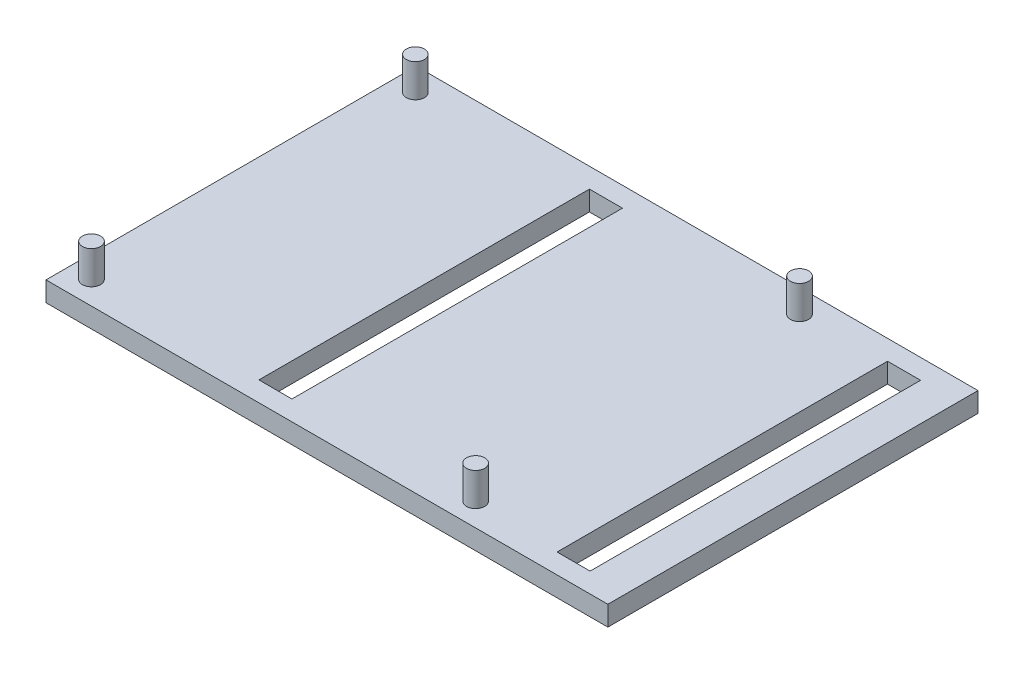
ISO-10303-21;
HEADER;
FILE_DESCRIPTION(('STEP AP214'),'2;1');
FILE_NAME('part.step','',(''),(''),'','','');
FILE_SCHEMA(('AUTOMOTIVE_DESIGN { 1 0 10303 214 1 1 1 1 }'));
ENDSEC;
DATA;
#1=APPLICATION_CONTEXT('core data for automotive mechanical design processes');
#2=APPLICATION_PROTOCOL_DEFINITION('international standard','automotive_design',2000,#1);
#3=PRODUCT_CONTEXT('',#1,'mechanical');
#4=PRODUCT('Part','Part','',(#3));
#5=PRODUCT_RELATED_PRODUCT_CATEGORY('part','',(#4));
#6=PRODUCT_DEFINITION_FORMATION('','',#4);
#7=PRODUCT_DEFINITION_CONTEXT('part definition',#1,'design');
#8=PRODUCT_DEFINITION('design','',#6,#7);
#9=PRODUCT_DEFINITION_SHAPE('','',#8);
#10=(LENGTH_UNIT() NAMED_UNIT(*) SI_UNIT(.MILLI.,.METRE.));
#11=(NAMED_UNIT(*) PLANE_ANGLE_UNIT() SI_UNIT($,.RADIAN.));
#12=(NAMED_UNIT(*) SI_UNIT($,.STERADIAN.) SOLID_ANGLE_UNIT());
#13=UNCERTAINTY_MEASURE_WITH_UNIT(LENGTH_MEASURE(1.E-05),#10,'distance_accuracy_value','');
#14=(GEOMETRIC_REPRESENTATION_CONTEXT(3) GLOBAL_UNCERTAINTY_ASSIGNED_CONTEXT((#13)) GLOBAL_UNIT_ASSIGNED_CONTEXT((#10,
#11,#12)) REPRESENTATION_CONTEXT('',''));
#15=CARTESIAN_POINT('',(0.,0.,0.));
#16=DIRECTION('',(0.,0.,1.));
#17=DIRECTION('',(1.,0.,0.));
#18=AXIS2_PLACEMENT_3D('',#15,#16,#17);
#19=CARTESIAN_POINT('',(0.,0.,0.));
#20=DIRECTION('',(0.,-1.,0.));
#21=DIRECTION('',(0.,0.,-1.));
#22=AXIS2_PLACEMENT_3D('',#19,#20,#21);
#23=PLANE('',#22);
#24=CARTESIAN_POINT('',(19.,0.,24.5));
#25=DIRECTION('',(0.,-1.,0.));
#26=DIRECTION('',(0.,0.,-1.));
#27=AXIS2_PLACEMENT_3D('',#24,#25,#26);
#28=CIRCLE('',#27,2.76);
#29=CARTESIAN_POINT('',(19.,0.,21.74));
#30=VERTEX_POINT('',#29);
#31=EDGE_CURVE('E253',#30,#30,#28,.T.);
#32=ORIENTED_EDGE('',*,*,#31,.F.);
#33=EDGE_LOOP('',(#32));
#34=FACE_BOUND('',#33,.T.);
#35=CARTESIAN_POINT('',(19.,0.,-24.5));
#36=DIRECTION('',(0.,1.,0.));
#37=DIRECTION('',(0.,0.,1.));
#38=AXIS2_PLACEMENT_3D('',#35,#36,#37);
#39=CIRCLE('',#38,2.76);
#40=CARTESIAN_POINT('',(19.,0.,-21.74));
#41=VERTEX_POINT('',#40);
#42=EDGE_CURVE('E209',#41,#41,#39,.T.);
#43=ORIENTED_EDGE('',*,*,#42,.T.);
#44=EDGE_LOOP('',(#43));
#45=FACE_BOUND('',#44,.T.);
#46=DIRECTION('',(-1.,0.,0.));
#47=VECTOR('',#46,1.);
#48=CARTESIAN_POINT('',(-8.28756070361921,0.,-25.));
#49=LINE('',#48,#47);
#50=CARTESIAN_POINT('',(-8.28756070361921,0.,-25.));
#51=VERTEX_POINT('',#50);
#52=CARTESIAN_POINT('',(-13.2875607036192,0.,-25.));
#53=VERTEX_POINT('',#52);
#54=EDGE_CURVE('E191',#51,#53,#49,.T.);
#55=ORIENTED_EDGE('',*,*,#54,.T.);
#56=DIRECTION('',(0.,0.,1.));
#57=VECTOR('',#56,1.);
#58=CARTESIAN_POINT('',(-13.2875607036192,0.,-25.));
#59=LINE('',#58,#57);
#60=CARTESIAN_POINT('',(-13.2875607036192,0.,25.));
#61=VERTEX_POINT('',#60);
#62=EDGE_CURVE('E187',#53,#61,#59,.T.);
#63=ORIENTED_EDGE('',*,*,#62,.T.);
#64=DIRECTION('',(1.,0.,0.));
#65=VECTOR('',#64,1.);
#66=CARTESIAN_POINT('',(-8.28756070361921,0.,25.));
#67=LINE('',#66,#65);
#68=CARTESIAN_POINT('',(-8.28756070361921,0.,25.));
#69=VERTEX_POINT('',#68);
#70=EDGE_CURVE('E190',#61,#69,#67,.T.);
#71=ORIENTED_EDGE('',*,*,#70,.T.);
#72=DIRECTION('',(0.,0.,-1.));
#73=VECTOR('',#72,1.);
#74=CARTESIAN_POINT('',(-8.28756070361921,0.,-25.));
#75=LINE('',#74,#73);
#76=EDGE_CURVE('E170',#69,#51,#75,.T.);
#77=ORIENTED_EDGE('',*,*,#76,.T.);
#78=EDGE_LOOP('',(#55,#63,#71,#77));
#79=FACE_BOUND('',#78,.T.);
#80=DIRECTION('',(0.,0.,1.));
#81=VECTOR('',#80,1.);
#82=CARTESIAN_POINT('',(-42.5,0.,-28.));
#83=LINE('',#82,#81);
#84=CARTESIAN_POINT('',(-42.5,0.,-28.));
#85=VERTEX_POINT('',#84);
#86=CARTESIAN_POINT('',(-42.5,0.,28.));
#87=VERTEX_POINT('',#86);
#88=EDGE_CURVE('E167',#85,#87,#83,.T.);
#89=ORIENTED_EDGE('',*,*,#88,.F.);
#90=DIRECTION('',(-1.,0.,0.));
#91=VECTOR('',#90,1.);
#92=CARTESIAN_POINT('',(42.5,0.,-28.));
#93=LINE('',#92,#91);
#94=CARTESIAN_POINT('',(42.5,0.,-28.));
#95=VERTEX_POINT('',#94);
#96=EDGE_CURVE('E223',#95,#85,#93,.T.);
#97=ORIENTED_EDGE('',*,*,#96,.F.);
#98=DIRECTION('',(0.,0.,-1.));
#99=VECTOR('',#98,1.);
#100=CARTESIAN_POINT('',(42.5,0.,-28.));
#101=LINE('',#100,#99);
#102=CARTESIAN_POINT('',(42.5,0.,28.));
#103=VERTEX_POINT('',#102);
#104=EDGE_CURVE('E220',#103,#95,#101,.T.);
#105=ORIENTED_EDGE('',*,*,#104,.F.);
#106=DIRECTION('',(1.,0.,0.));
#107=VECTOR('',#106,1.);
#108=CARTESIAN_POINT('',(42.5,0.,28.));
#109=LINE('',#108,#107);
#110=EDGE_CURVE('E217',#87,#103,#109,.T.);
#111=ORIENTED_EDGE('',*,*,#110,.F.);
#112=EDGE_LOOP('',(#89,#97,#105,#111));
#113=FACE_BOUND('',#112,.T.);
#114=DIRECTION('',(-1.,0.,0.));
#115=VECTOR('',#114,1.);
#116=CARTESIAN_POINT('',(31.8133356797978,0.,-25.));
#117=LINE('',#116,#115);
#118=CARTESIAN_POINT('',(36.8133356797978,0.,-25.));
#119=VERTEX_POINT('',#118);
#120=CARTESIAN_POINT('',(31.8133356797978,0.,-25.));
#121=VERTEX_POINT('',#120);
#122=EDGE_CURVE('E162',#119,#121,#117,.T.);
#123=ORIENTED_EDGE('',*,*,#122,.T.);
#124=DIRECTION('',(0.,0.,1.));
#125=VECTOR('',#124,1.);
#126=CARTESIAN_POINT('',(31.8133356797978,0.,-25.));
#127=LINE('',#126,#125);
#128=CARTESIAN_POINT('',(31.8133356797978,0.,25.));
#129=VERTEX_POINT('',#128);
#130=EDGE_CURVE('E128',#121,#129,#127,.T.);
#131=ORIENTED_EDGE('',*,*,#130,.T.);
#132=DIRECTION('',(1.,0.,0.));
#133=VECTOR('',#132,1.);
#134=CARTESIAN_POINT('',(31.8133356797978,0.,25.));
#135=LINE('',#134,#133);
#136=CARTESIAN_POINT('',(36.8133356797978,0.,25.));
#137=VERTEX_POINT('',#136);
#138=EDGE_CURVE('E146',#129,#137,#135,.T.);
#139=ORIENTED_EDGE('',*,*,#138,.T.);
#140=DIRECTION('',(0.,0.,-1.));
#141=VECTOR('',#140,1.);
#142=CARTESIAN_POINT('',(36.8133356797978,0.,-25.));
#143=LINE('',#142,#141);
#144=EDGE_CURVE('E164',#137,#119,#143,.T.);
#145=ORIENTED_EDGE('',*,*,#144,.T.);
#146=EDGE_LOOP('',(#123,#131,#139,#145));
#147=FACE_BOUND('',#146,.T.);
#148=CARTESIAN_POINT('',(-39.1182865134503,0.,-24.5));
#149=DIRECTION('',(0.,1.,0.));
#150=DIRECTION('',(0.,0.,1.));
#151=AXIS2_PLACEMENT_3D('',#148,#149,#150);
#152=CIRCLE('',#151,2.76);
#153=CARTESIAN_POINT('',(-39.1182865134503,0.,-21.74));
#154=VERTEX_POINT('',#153);
#155=EDGE_CURVE('E250',#154,#154,#152,.T.);
#156=ORIENTED_EDGE('',*,*,#155,.T.);
#157=EDGE_LOOP('',(#156));
#158=FACE_BOUND('',#157,.T.);
#159=CARTESIAN_POINT('',(-39.1182865134503,0.,24.5));
#160=DIRECTION('',(0.,-1.,0.));
#161=DIRECTION('',(0.,0.,-1.));
#162=AXIS2_PLACEMENT_3D('',#159,#160,#161);
#163=CIRCLE('',#162,2.76);
#164=CARTESIAN_POINT('',(-39.1182865134503,0.,21.74));
#165=VERTEX_POINT('',#164);
#166=EDGE_CURVE('E262',#165,#165,#163,.T.);
#167=ORIENTED_EDGE('',*,*,#166,.F.);
#168=EDGE_LOOP('',(#167));
#169=FACE_BOUND('',#168,.T.);
#170=ADVANCED_FACE('F44',(#34,#45,#79,#113,#147,#158,#169),#23,.T.);
#171=CARTESIAN_POINT('',(-39.1182865134503,6.88908729652602,24.5));
#172=DIRECTION('',(0.,-1.,0.));
#173=DIRECTION('',(0.,0.,-1.));
#174=AXIS2_PLACEMENT_3D('',#171,#172,#173);
#175=CYLINDRICAL_SURFACE('',#174,1.375);
#176=CARTESIAN_POINT('',(-39.1182865134503,3.,24.5));
#177=DIRECTION('',(0.,-1.,0.));
#178=DIRECTION('',(0.,0.,-1.));
#179=AXIS2_PLACEMENT_3D('',#176,#177,#178);
#180=CIRCLE('',#179,1.375);
#181=CARTESIAN_POINT('',(-39.1182865134503,3.,23.125));
#182=VERTEX_POINT('',#181);
#183=EDGE_CURVE('E12',#182,#182,#180,.F.);
#184=ORIENTED_EDGE('',*,*,#183,.T.);
#185=EDGE_LOOP('',(#184));
#186=FACE_BOUND('',#185,.T.);
#187=CARTESIAN_POINT('',(-39.1182865134503,2.,24.5));
#188=DIRECTION('',(0.,-1.,0.));
#189=DIRECTION('',(0.,0.,-1.));
#190=AXIS2_PLACEMENT_3D('',#187,#188,#189);
#191=CIRCLE('',#190,1.375);
#192=CARTESIAN_POINT('',(-39.1182865134503,2.,23.125));
#193=VERTEX_POINT('',#192);
#194=EDGE_CURVE('E259',#193,#193,#191,.T.);
#195=ORIENTED_EDGE('',*,*,#194,.T.);
#196=EDGE_LOOP('',(#195));
#197=FACE_BOUND('',#196,.T.);
#198=ADVANCED_FACE('F46',(#186,#197),#175,.F.);
#199=CARTESIAN_POINT('',(19.,6.88908729652602,24.5));
#200=DIRECTION('',(0.,-1.,0.));
#201=DIRECTION('',(0.,0.,-1.));
#202=AXIS2_PLACEMENT_3D('',#199,#200,#201);
#203=CYLINDRICAL_SURFACE('',#202,1.37499999999999);
#204=CARTESIAN_POINT('',(19.,3.,24.5));
#205=DIRECTION('',(0.,-1.,0.));
#206=DIRECTION('',(0.,0.,-1.));
#207=AXIS2_PLACEMENT_3D('',#204,#205,#206);
#208=CIRCLE('',#207,1.37499999999999);
#209=CARTESIAN_POINT('',(19.,3.,23.125));
#210=VERTEX_POINT('',#209);
#211=EDGE_CURVE('E172',#210,#210,#208,.F.);
#212=ORIENTED_EDGE('',*,*,#211,.T.);
#213=EDGE_LOOP('',(#212));
#214=FACE_BOUND('',#213,.T.);
#215=CARTESIAN_POINT('',(19.,2.,24.5));
#216=DIRECTION('',(0.,-1.,0.));
#217=DIRECTION('',(0.,0.,-1.));
#218=AXIS2_PLACEMENT_3D('',#215,#216,#217);
#219=CIRCLE('',#218,1.375);
#220=CARTESIAN_POINT('',(19.,2.,23.125));
#221=VERTEX_POINT('',#220);
#222=EDGE_CURVE('E256',#221,#221,#219,.T.);
#223=ORIENTED_EDGE('',*,*,#222,.T.);
#224=EDGE_LOOP('',(#223));
#225=FACE_BOUND('',#224,.T.);
#226=ADVANCED_FACE('F276',(#214,#225),#203,.F.);
#227=CARTESIAN_POINT('',(-39.1182865134503,6.88908729652602,-24.5));
#228=DIRECTION('',(0.,-1.,0.));
#229=DIRECTION('',(0.,0.,-1.));
#230=AXIS2_PLACEMENT_3D('',#227,#228,#229);
#231=CYLINDRICAL_SURFACE('',#230,1.375);
#232=CARTESIAN_POINT('',(-39.1182865134503,3.,-24.5));
#233=DIRECTION('',(0.,-1.,0.));
#234=DIRECTION('',(0.,0.,-1.));
#235=AXIS2_PLACEMENT_3D('',#232,#233,#234);
#236=CIRCLE('',#235,1.375);
#237=CARTESIAN_POINT('',(-39.1182865134503,3.,-25.875));
#238=VERTEX_POINT('',#237);
#239=EDGE_CURVE('E53',#238,#238,#236,.F.);
#240=ORIENTED_EDGE('',*,*,#239,.T.);
#241=EDGE_LOOP('',(#240));
#242=FACE_BOUND('',#241,.T.);
#243=CARTESIAN_POINT('',(-39.1182865134503,2.,-24.5));
#244=DIRECTION('',(0.,1.,0.));
#245=DIRECTION('',(0.,0.,1.));
#246=AXIS2_PLACEMENT_3D('',#243,#244,#245);
#247=CIRCLE('',#246,1.375);
#248=CARTESIAN_POINT('',(-39.1182865134503,2.,-23.125));
#249=VERTEX_POINT('',#248);
#250=EDGE_CURVE('E247',#249,#249,#247,.T.);
#251=ORIENTED_EDGE('',*,*,#250,.F.);
#252=EDGE_LOOP('',(#251));
#253=FACE_BOUND('',#252,.T.);
#254=ADVANCED_FACE('F301',(#242,#253),#231,.F.);
#255=CARTESIAN_POINT('',(19.,6.88908729652602,-24.5));
#256=DIRECTION('',(0.,-1.,0.));
#257=DIRECTION('',(0.,0.,-1.));
#258=AXIS2_PLACEMENT_3D('',#255,#256,#257);
#259=CYLINDRICAL_SURFACE('',#258,1.375);
#260=CARTESIAN_POINT('',(19.,3.,-24.5));
#261=DIRECTION('',(0.,-1.,0.));
#262=DIRECTION('',(0.,0.,-1.));
#263=AXIS2_PLACEMENT_3D('',#260,#261,#262);
#264=CIRCLE('',#263,1.375);
#265=CARTESIAN_POINT('',(19.,3.,-25.875));
#266=VERTEX_POINT('',#265);
#267=EDGE_CURVE('E232',#266,#266,#264,.F.);
#268=ORIENTED_EDGE('',*,*,#267,.T.);
#269=EDGE_LOOP('',(#268));
#270=FACE_BOUND('',#269,.T.);
#271=CARTESIAN_POINT('',(19.,2.,-24.5));
#272=DIRECTION('',(0.,1.,0.));
#273=DIRECTION('',(0.,0.,1.));
#274=AXIS2_PLACEMENT_3D('',#271,#272,#273);
#275=CIRCLE('',#274,1.375);
#276=CARTESIAN_POINT('',(19.,2.,-23.125));
#277=VERTEX_POINT('',#276);
#278=EDGE_CURVE('E244',#277,#277,#275,.T.);
#279=ORIENTED_EDGE('',*,*,#278,.F.);
#280=EDGE_LOOP('',(#279));
#281=FACE_BOUND('',#280,.T.);
#282=ADVANCED_FACE('F299',(#270,#281),#259,.F.);
#283=CARTESIAN_POINT('',(0.,3.,0.));
#284=DIRECTION('',(0.,-1.,0.));
#285=DIRECTION('',(0.,0.,-1.));
#286=AXIS2_PLACEMENT_3D('',#283,#284,#285);
#287=PLANE('',#286);
#288=ORIENTED_EDGE('',*,*,#267,.F.);
#289=EDGE_LOOP('',(#288));
#290=FACE_BOUND('',#289,.T.);
#291=ORIENTED_EDGE('',*,*,#239,.F.);
#292=EDGE_LOOP('',(#291));
#293=FACE_BOUND('',#292,.T.);
#294=DIRECTION('',(0.,0.,1.));
#295=VECTOR('',#294,1.);
#296=CARTESIAN_POINT('',(-13.2875607036192,3.,-25.));
#297=LINE('',#296,#295);
#298=CARTESIAN_POINT('',(-13.2875607036192,3.,-25.));
#299=VERTEX_POINT('',#298);
#300=CARTESIAN_POINT('',(-13.2875607036192,3.,25.));
#301=VERTEX_POINT('',#300);
#302=EDGE_CURVE('E174',#299,#301,#297,.T.);
#303=ORIENTED_EDGE('',*,*,#302,.F.);
#304=DIRECTION('',(-1.,0.,0.));
#305=VECTOR('',#304,1.);
#306=CARTESIAN_POINT('',(-8.28756070361921,3.,-25.));
#307=LINE('',#306,#305);
#308=CARTESIAN_POINT('',(-8.28756070361921,3.,-25.));
#309=VERTEX_POINT('',#308);
#310=EDGE_CURVE('E185',#309,#299,#307,.T.);
#311=ORIENTED_EDGE('',*,*,#310,.F.);
#312=DIRECTION('',(0.,0.,-1.));
#313=VECTOR('',#312,1.);
#314=CARTESIAN_POINT('',(-8.28756070361921,3.,-25.));
#315=LINE('',#314,#313);
#316=CARTESIAN_POINT('',(-8.28756070361921,3.,25.));
#317=VERTEX_POINT('',#316);
#318=EDGE_CURVE('E181',#317,#309,#315,.T.);
#319=ORIENTED_EDGE('',*,*,#318,.F.);
#320=DIRECTION('',(1.,0.,0.));
#321=VECTOR('',#320,1.);
#322=CARTESIAN_POINT('',(-8.28756070361921,3.,25.));
#323=LINE('',#322,#321);
#324=EDGE_CURVE('E178',#301,#317,#323,.T.);
#325=ORIENTED_EDGE('',*,*,#324,.F.);
#326=EDGE_LOOP('',(#303,#311,#319,#325));
#327=FACE_BOUND('',#326,.T.);
#328=DIRECTION('',(0.,0.,1.));
#329=VECTOR('',#328,1.);
#330=CARTESIAN_POINT('',(-42.5,3.,-28.));
#331=LINE('',#330,#329);
#332=CARTESIAN_POINT('',(-42.5,3.,-28.));
#333=VERTEX_POINT('',#332);
#334=CARTESIAN_POINT('',(-42.5,3.,28.));
#335=VERTEX_POINT('',#334);
#336=EDGE_CURVE('E205',#333,#335,#331,.T.);
#337=ORIENTED_EDGE('',*,*,#336,.T.);
#338=DIRECTION('',(1.,0.,0.));
#339=VECTOR('',#338,1.);
#340=CARTESIAN_POINT('',(42.5,3.,28.));
#341=LINE('',#340,#339);
#342=CARTESIAN_POINT('',(42.5,3.,28.));
#343=VERTEX_POINT('',#342);
#344=EDGE_CURVE('E208',#335,#343,#341,.T.);
#345=ORIENTED_EDGE('',*,*,#344,.T.);
#346=DIRECTION('',(0.,0.,-1.));
#347=VECTOR('',#346,1.);
#348=CARTESIAN_POINT('',(42.5,3.,-28.));
#349=LINE('',#348,#347);
#350=CARTESIAN_POINT('',(42.5,3.,-28.));
#351=VERTEX_POINT('',#350);
#352=EDGE_CURVE('E211',#343,#351,#349,.T.);
#353=ORIENTED_EDGE('',*,*,#352,.T.);
#354=DIRECTION('',(-1.,0.,0.));
#355=VECTOR('',#354,1.);
#356=CARTESIAN_POINT('',(42.5,3.,-28.));
#357=LINE('',#356,#355);
#358=EDGE_CURVE('E198',#351,#333,#357,.T.);
#359=ORIENTED_EDGE('',*,*,#358,.T.);
#360=EDGE_LOOP('',(#337,#345,#353,#359));
#361=FACE_BOUND('',#360,.T.);
#362=DIRECTION('',(0.,0.,1.));
#363=VECTOR('',#362,1.);
#364=CARTESIAN_POINT('',(31.8133356797978,3.,-25.));
#365=LINE('',#364,#363);
#366=CARTESIAN_POINT('',(31.8133356797978,3.,-25.));
#367=VERTEX_POINT('',#366);
#368=CARTESIAN_POINT('',(31.8133356797978,3.,25.));
#369=VERTEX_POINT('',#368);
#370=EDGE_CURVE('E131',#367,#369,#365,.T.);
#371=ORIENTED_EDGE('',*,*,#370,.F.);
#372=DIRECTION('',(-1.,0.,0.));
#373=VECTOR('',#372,1.);
#374=CARTESIAN_POINT('',(31.8133356797978,3.,-25.));
#375=LINE('',#374,#373);
#376=CARTESIAN_POINT('',(36.8133356797978,3.,-25.));
#377=VERTEX_POINT('',#376);
#378=EDGE_CURVE('E60',#377,#367,#375,.T.);
#379=ORIENTED_EDGE('',*,*,#378,.F.);
#380=DIRECTION('',(0.,0.,-1.));
#381=VECTOR('',#380,1.);
#382=CARTESIAN_POINT('',(36.8133356797978,3.,-25.));
#383=LINE('',#382,#381);
#384=CARTESIAN_POINT('',(36.8133356797978,3.,25.));
#385=VERTEX_POINT('',#384);
#386=EDGE_CURVE('E152',#385,#377,#383,.T.);
#387=ORIENTED_EDGE('',*,*,#386,.F.);
#388=DIRECTION('',(1.,0.,0.));
#389=VECTOR('',#388,1.);
#390=CARTESIAN_POINT('',(31.8133356797978,3.,25.));
#391=LINE('',#390,#389);
#392=EDGE_CURVE('E143',#369,#385,#391,.T.);
#393=ORIENTED_EDGE('',*,*,#392,.F.);
#394=EDGE_LOOP('',(#371,#379,#387,#393));
#395=FACE_BOUND('',#394,.T.);
#396=ORIENTED_EDGE('',*,*,#183,.F.);
#397=EDGE_LOOP('',(#396));
#398=FACE_BOUND('',#397,.T.);
#399=ORIENTED_EDGE('',*,*,#211,.F.);
#400=EDGE_LOOP('',(#399));
#401=FACE_BOUND('',#400,.T.);
#402=ADVANCED_FACE('F149',(#290,#293,#327,#361,#395,#398,#401),#287,.F.);
#403=CARTESIAN_POINT('',(-42.5,3.,-28.));
#404=DIRECTION('',(1.,0.,0.));
#405=DIRECTION('',(0.,0.,-1.));
#406=AXIS2_PLACEMENT_3D('',#403,#404,#405);
#407=PLANE('',#406);
#408=ORIENTED_EDGE('',*,*,#88,.T.);
#409=DIRECTION('',(0.,-1.,0.));
#410=VECTOR('',#409,1.);
#411=CARTESIAN_POINT('',(-42.5,3.,28.));
#412=LINE('',#411,#410);
#413=EDGE_CURVE('E219',#335,#87,#412,.T.);
#414=ORIENTED_EDGE('',*,*,#413,.F.);
#415=ORIENTED_EDGE('',*,*,#336,.F.);
#416=DIRECTION('',(0.,-1.,0.));
#417=VECTOR('',#416,1.);
#418=CARTESIAN_POINT('',(-42.5,3.,-28.));
#419=LINE('',#418,#417);
#420=EDGE_CURVE('E216',#333,#85,#419,.T.);
#421=ORIENTED_EDGE('',*,*,#420,.T.);
#422=EDGE_LOOP('',(#408,#414,#415,#421));
#423=FACE_BOUND('',#422,.T.);
#424=ADVANCED_FACE('F295',(#423),#407,.F.);
#425=CARTESIAN_POINT('',(42.5,3.,28.));
#426=DIRECTION('',(0.,0.,-1.));
#427=DIRECTION('',(-1.,0.,0.));
#428=AXIS2_PLACEMENT_3D('',#425,#426,#427);
#429=PLANE('',#428);
#430=ORIENTED_EDGE('',*,*,#110,.T.);
#431=DIRECTION('',(0.,-1.,0.));
#432=VECTOR('',#431,1.);
#433=CARTESIAN_POINT('',(42.5,3.,28.));
#434=LINE('',#433,#432);
#435=EDGE_CURVE('E222',#343,#103,#434,.T.);
#436=ORIENTED_EDGE('',*,*,#435,.F.);
#437=ORIENTED_EDGE('',*,*,#344,.F.);
#438=ORIENTED_EDGE('',*,*,#413,.T.);
#439=EDGE_LOOP('',(#430,#436,#437,#438));
#440=FACE_BOUND('',#439,.T.);
#441=ADVANCED_FACE('F291',(#440),#429,.F.);
#442=CARTESIAN_POINT('',(42.5,3.,-28.));
#443=DIRECTION('',(-1.,0.,0.));
#444=DIRECTION('',(0.,0.,1.));
#445=AXIS2_PLACEMENT_3D('',#442,#443,#444);
#446=PLANE('',#445);
#447=ORIENTED_EDGE('',*,*,#104,.T.);
#448=DIRECTION('',(0.,-1.,0.));
#449=VECTOR('',#448,1.);
#450=CARTESIAN_POINT('',(42.5,3.,-28.));
#451=LINE('',#450,#449);
#452=EDGE_CURVE('E177',#351,#95,#451,.T.);
#453=ORIENTED_EDGE('',*,*,#452,.F.);
#454=ORIENTED_EDGE('',*,*,#352,.F.);
#455=ORIENTED_EDGE('',*,*,#435,.T.);
#456=EDGE_LOOP('',(#447,#453,#454,#455));
#457=FACE_BOUND('',#456,.T.);
#458=ADVANCED_FACE('F287',(#457),#446,.F.);
#459=CARTESIAN_POINT('',(42.5,3.,-28.));
#460=DIRECTION('',(0.,0.,1.));
#461=DIRECTION('',(1.,0.,0.));
#462=AXIS2_PLACEMENT_3D('',#459,#460,#461);
#463=PLANE('',#462);
#464=ORIENTED_EDGE('',*,*,#96,.T.);
#465=ORIENTED_EDGE('',*,*,#420,.F.);
#466=ORIENTED_EDGE('',*,*,#358,.F.);
#467=ORIENTED_EDGE('',*,*,#452,.T.);
#468=EDGE_LOOP('',(#464,#465,#466,#467));
#469=FACE_BOUND('',#468,.T.);
#470=ADVANCED_FACE('F283',(#469),#463,.F.);
#471=CARTESIAN_POINT('',(-13.2875607036192,3.,-25.));
#472=DIRECTION('',(1.,0.,0.));
#473=DIRECTION('',(0.,0.,-1.));
#474=AXIS2_PLACEMENT_3D('',#471,#472,#473);
#475=PLANE('',#474);
#476=ORIENTED_EDGE('',*,*,#62,.F.);
#477=DIRECTION('',(0.,-1.,0.));
#478=VECTOR('',#477,1.);
#479=CARTESIAN_POINT('',(-13.2875607036192,3.,-25.));
#480=LINE('',#479,#478);
#481=EDGE_CURVE('E138',#299,#53,#480,.T.);
#482=ORIENTED_EDGE('',*,*,#481,.F.);
#483=ORIENTED_EDGE('',*,*,#302,.T.);
#484=DIRECTION('',(0.,-1.,0.));
#485=VECTOR('',#484,1.);
#486=CARTESIAN_POINT('',(-13.2875607036192,3.,25.));
#487=LINE('',#486,#485);
#488=EDGE_CURVE('E176',#301,#61,#487,.T.);
#489=ORIENTED_EDGE('',*,*,#488,.T.);
#490=EDGE_LOOP('',(#476,#482,#483,#489));
#491=FACE_BOUND('',#490,.T.);
#492=ADVANCED_FACE('F286',(#491),#475,.T.);
#493=CARTESIAN_POINT('',(-8.28756070361921,3.,25.));
#494=DIRECTION('',(0.,0.,-1.));
#495=DIRECTION('',(-1.,0.,0.));
#496=AXIS2_PLACEMENT_3D('',#493,#494,#495);
#497=PLANE('',#496);
#498=ORIENTED_EDGE('',*,*,#70,.F.);
#499=ORIENTED_EDGE('',*,*,#488,.F.);
#500=ORIENTED_EDGE('',*,*,#324,.T.);
#501=DIRECTION('',(0.,-1.,0.));
#502=VECTOR('',#501,1.);
#503=CARTESIAN_POINT('',(-8.28756070361921,3.,25.));
#504=LINE('',#503,#502);
#505=EDGE_CURVE('E180',#317,#69,#504,.T.);
#506=ORIENTED_EDGE('',*,*,#505,.T.);
#507=EDGE_LOOP('',(#498,#499,#500,#506));
#508=FACE_BOUND('',#507,.T.);
#509=ADVANCED_FACE('F358',(#508),#497,.T.);
#510=CARTESIAN_POINT('',(-8.28756070361921,3.,-25.));
#511=DIRECTION('',(-1.,0.,0.));
#512=DIRECTION('',(0.,0.,1.));
#513=AXIS2_PLACEMENT_3D('',#510,#511,#512);
#514=PLANE('',#513);
#515=ORIENTED_EDGE('',*,*,#76,.F.);
#516=ORIENTED_EDGE('',*,*,#505,.F.);
#517=ORIENTED_EDGE('',*,*,#318,.T.);
#518=DIRECTION('',(0.,-1.,0.));
#519=VECTOR('',#518,1.);
#520=CARTESIAN_POINT('',(-8.28756070361921,3.,-25.));
#521=LINE('',#520,#519);
#522=EDGE_CURVE('E184',#309,#51,#521,.T.);
#523=ORIENTED_EDGE('',*,*,#522,.T.);
#524=EDGE_LOOP('',(#515,#516,#517,#523));
#525=FACE_BOUND('',#524,.T.);
#526=ADVANCED_FACE('F354',(#525),#514,.T.);
#527=CARTESIAN_POINT('',(-8.28756070361921,3.,-25.));
#528=DIRECTION('',(0.,0.,1.));
#529=DIRECTION('',(1.,0.,0.));
#530=AXIS2_PLACEMENT_3D('',#527,#528,#529);
#531=PLANE('',#530);
#532=ORIENTED_EDGE('',*,*,#54,.F.);
#533=ORIENTED_EDGE('',*,*,#522,.F.);
#534=ORIENTED_EDGE('',*,*,#310,.T.);
#535=ORIENTED_EDGE('',*,*,#481,.T.);
#536=EDGE_LOOP('',(#532,#533,#534,#535));
#537=FACE_BOUND('',#536,.T.);
#538=ADVANCED_FACE('F351',(#537),#531,.T.);
#539=CARTESIAN_POINT('',(31.8133356797978,3.,-25.));
#540=DIRECTION('',(1.,0.,0.));
#541=DIRECTION('',(0.,0.,-1.));
#542=AXIS2_PLACEMENT_3D('',#539,#540,#541);
#543=PLANE('',#542);
#544=ORIENTED_EDGE('',*,*,#130,.F.);
#545=DIRECTION('',(0.,-1.,0.));
#546=VECTOR('',#545,1.);
#547=CARTESIAN_POINT('',(31.8133356797978,3.,-25.));
#548=LINE('',#547,#546);
#549=EDGE_CURVE('E135',#367,#121,#548,.T.);
#550=ORIENTED_EDGE('',*,*,#549,.F.);
#551=ORIENTED_EDGE('',*,*,#370,.T.);
#552=DIRECTION('',(0.,-1.,0.));
#553=VECTOR('',#552,1.);
#554=CARTESIAN_POINT('',(31.8133356797978,3.,25.));
#555=LINE('',#554,#553);
#556=EDGE_CURVE('E134',#369,#129,#555,.T.);
#557=ORIENTED_EDGE('',*,*,#556,.T.);
#558=EDGE_LOOP('',(#544,#550,#551,#557));
#559=FACE_BOUND('',#558,.T.);
#560=ADVANCED_FACE('F133',(#559),#543,.T.);
#561=CARTESIAN_POINT('',(31.8133356797978,3.,25.));
#562=DIRECTION('',(0.,0.,-1.));
#563=DIRECTION('',(-1.,0.,0.));
#564=AXIS2_PLACEMENT_3D('',#561,#562,#563);
#565=PLANE('',#564);
#566=ORIENTED_EDGE('',*,*,#138,.F.);
#567=ORIENTED_EDGE('',*,*,#556,.F.);
#568=ORIENTED_EDGE('',*,*,#392,.T.);
#569=DIRECTION('',(0.,-1.,0.));
#570=VECTOR('',#569,1.);
#571=CARTESIAN_POINT('',(36.8133356797978,3.,25.));
#572=LINE('',#571,#570);
#573=EDGE_CURVE('E153',#385,#137,#572,.T.);
#574=ORIENTED_EDGE('',*,*,#573,.T.);
#575=EDGE_LOOP('',(#566,#567,#568,#574));
#576=FACE_BOUND('',#575,.T.);
#577=ADVANCED_FACE('F142',(#576),#565,.T.);
#578=CARTESIAN_POINT('',(36.8133356797978,3.,-25.));
#579=DIRECTION('',(-1.,0.,0.));
#580=DIRECTION('',(0.,0.,1.));
#581=AXIS2_PLACEMENT_3D('',#578,#579,#580);
#582=PLANE('',#581);
#583=ORIENTED_EDGE('',*,*,#144,.F.);
#584=ORIENTED_EDGE('',*,*,#573,.F.);
#585=ORIENTED_EDGE('',*,*,#386,.T.);
#586=DIRECTION('',(0.,-1.,0.));
#587=VECTOR('',#586,1.);
#588=CARTESIAN_POINT('',(36.8133356797978,3.,-25.));
#589=LINE('',#588,#587);
#590=EDGE_CURVE('E159',#377,#119,#589,.T.);
#591=ORIENTED_EDGE('',*,*,#590,.T.);
#592=EDGE_LOOP('',(#583,#584,#585,#591));
#593=FACE_BOUND('',#592,.T.);
#594=ADVANCED_FACE('F343',(#593),#582,.T.);
#595=CARTESIAN_POINT('',(31.8133356797978,3.,-25.));
#596=DIRECTION('',(0.,0.,1.));
#597=DIRECTION('',(1.,0.,0.));
#598=AXIS2_PLACEMENT_3D('',#595,#596,#597);
#599=PLANE('',#598);
#600=ORIENTED_EDGE('',*,*,#122,.F.);
#601=ORIENTED_EDGE('',*,*,#590,.F.);
#602=ORIENTED_EDGE('',*,*,#378,.T.);
#603=ORIENTED_EDGE('',*,*,#549,.T.);
#604=EDGE_LOOP('',(#600,#601,#602,#603));
#605=FACE_BOUND('',#604,.T.);
#606=ADVANCED_FACE('F316',(#605),#599,.T.);
#607=CARTESIAN_POINT('',(19.,0.,-24.5));
#608=DIRECTION('',(0.,-1.,0.));
#609=DIRECTION('',(0.,0.,-1.));
#610=AXIS2_PLACEMENT_3D('',#607,#608,#609);
#611=CONICAL_SURFACE('',#610,2.76,0.60567465190529);
#612=ORIENTED_EDGE('',*,*,#278,.T.);
#613=EDGE_LOOP('',(#612));
#614=FACE_BOUND('',#613,.T.);
#615=ORIENTED_EDGE('',*,*,#42,.F.);
#616=EDGE_LOOP('',(#615));
#617=FACE_BOUND('',#616,.T.);
#618=ADVANCED_FACE('F313',(#614,#617),#611,.F.);
#619=CARTESIAN_POINT('',(-39.1182865134503,0.,-24.5));
#620=DIRECTION('',(0.,-1.,0.));
#621=DIRECTION('',(0.,0.,-1.));
#622=AXIS2_PLACEMENT_3D('',#619,#620,#621);
#623=CONICAL_SURFACE('',#622,2.76,0.60567465190529);
#624=ORIENTED_EDGE('',*,*,#250,.T.);
#625=EDGE_LOOP('',(#624));
#626=FACE_BOUND('',#625,.T.);
#627=ORIENTED_EDGE('',*,*,#155,.F.);
#628=EDGE_LOOP('',(#627));
#629=FACE_BOUND('',#628,.T.);
#630=ADVANCED_FACE('F315',(#626,#629),#623,.F.);
#631=CARTESIAN_POINT('',(19.,0.,24.5));
#632=DIRECTION('',(0.,-1.,0.));
#633=DIRECTION('',(0.,0.,1.));
#634=AXIS2_PLACEMENT_3D('',#631,#632,#633);
#635=CONICAL_SURFACE('',#634,2.76,0.60567465190529);
#636=ORIENTED_EDGE('',*,*,#222,.F.);
#637=EDGE_LOOP('',(#636));
#638=FACE_BOUND('',#637,.T.);
#639=ORIENTED_EDGE('',*,*,#31,.T.);
#640=EDGE_LOOP('',(#639));
#641=FACE_BOUND('',#640,.T.);
#642=ADVANCED_FACE('F330',(#638,#641),#635,.F.);
#643=CARTESIAN_POINT('',(-39.1182865134503,0.,24.5));
#644=DIRECTION('',(0.,-1.,0.));
#645=DIRECTION('',(0.,0.,1.));
#646=AXIS2_PLACEMENT_3D('',#643,#644,#645);
#647=CONICAL_SURFACE('',#646,2.76,0.60567465190529);
#648=ORIENTED_EDGE('',*,*,#194,.F.);
#649=EDGE_LOOP('',(#648));
#650=FACE_BOUND('',#649,.T.);
#651=ORIENTED_EDGE('',*,*,#166,.T.);
#652=EDGE_LOOP('',(#651));
#653=FACE_BOUND('',#652,.T.);
#654=ADVANCED_FACE('F266',(#650,#653),#647,.F.);
#655=CLOSED_SHELL('',(#170,#198,#226,#254,#282,#402,#424,#441,#458,#470,#492,#509,#526,#538,
#560,#577,#594,#606,#618,#630,#642,#654));
#656=MANIFOLD_SOLID_BREP('B2',#655);
#657=CARTESIAN_POINT('',(-39.1182865134503,8.,24.5));
#658=DIRECTION('',(0.,-1.,0.));
#659=DIRECTION('',(0.,0.,-1.));
#660=AXIS2_PLACEMENT_3D('',#657,#658,#659);
#661=PLANE('',#660);
#662=CARTESIAN_POINT('',(-39.1182865134503,8.,24.5));
#663=DIRECTION('',(0.,1.,0.));
#664=DIRECTION('',(0.,0.,-1.));
#665=AXIS2_PLACEMENT_3D('',#662,#663,#664);
#666=CIRCLE('',#665,1.375);
#667=CARTESIAN_POINT('',(-39.1182865134503,8.,23.125));
#668=VERTEX_POINT('',#667);
#669=EDGE_CURVE('E43',#668,#668,#666,.T.);
#670=ORIENTED_EDGE('',*,*,#669,.T.);
#671=EDGE_LOOP('',(#670));
#672=FACE_BOUND('',#671,.T.);
#673=ADVANCED_FACE('F531',(#672),#661,.F.);
#674=CARTESIAN_POINT('',(-39.1182865134503,8.,24.5));
#675=DIRECTION('',(0.,-1.,0.));
#676=DIRECTION('',(0.,0.,-1.));
#677=AXIS2_PLACEMENT_3D('',#674,#675,#676);
#678=CYLINDRICAL_SURFACE('',#677,1.375);
#679=ORIENTED_EDGE('',*,*,#669,.F.);
#680=EDGE_LOOP('',(#679));
#681=FACE_BOUND('',#680,.T.);
#682=CARTESIAN_POINT('',(-39.1182865134503,3.,24.5));
#683=DIRECTION('',(0.,-1.,0.));
#684=DIRECTION('',(0.,0.,-1.));
#685=AXIS2_PLACEMENT_3D('',#682,#683,#684);
#686=CIRCLE('',#685,1.375);
#687=CARTESIAN_POINT('',(-39.1182865134503,3.,23.125));
#688=VERTEX_POINT('',#687);
#689=EDGE_CURVE('E537',#688,#688,#686,.F.);
#690=ORIENTED_EDGE('',*,*,#689,.T.);
#691=EDGE_LOOP('',(#690));
#692=FACE_BOUND('',#691,.T.);
#693=ADVANCED_FACE('F543',(#681,#692),#678,.T.);
#694=CARTESIAN_POINT('',(0.,3.,0.));
#695=DIRECTION('',(0.,-1.,0.));
#696=DIRECTION('',(0.,0.,-1.));
#697=AXIS2_PLACEMENT_3D('',#694,#695,#696);
#698=PLANE('',#697);
#699=ORIENTED_EDGE('',*,*,#689,.F.);
#700=EDGE_LOOP('',(#699));
#701=FACE_BOUND('',#700,.T.);
#702=ADVANCED_FACE('F545',(#701),#698,.T.);
#703=CLOSED_SHELL('',(#673,#693,#702));
#704=MANIFOLD_SOLID_BREP('B6',#703);
#705=CARTESIAN_POINT('',(-39.1182865134503,8.,-24.5));
#706=DIRECTION('',(0.,1.,0.));
#707=DIRECTION('',(0.,0.,1.));
#708=AXIS2_PLACEMENT_3D('',#705,#706,#707);
#709=PLANE('',#708);
#710=CARTESIAN_POINT('',(-39.1182865134503,8.,-24.5));
#711=DIRECTION('',(0.,1.,0.));
#712=DIRECTION('',(0.,0.,1.));
#713=AXIS2_PLACEMENT_3D('',#710,#711,#712);
#714=CIRCLE('',#713,1.375);
#715=CARTESIAN_POINT('',(-39.1182865134503,8.,-23.125));
#716=VERTEX_POINT('',#715);
#717=EDGE_CURVE('E530',#716,#716,#714,.T.);
#718=ORIENTED_EDGE('',*,*,#717,.T.);
#719=EDGE_LOOP('',(#718));
#720=FACE_BOUND('',#719,.T.);
#721=ADVANCED_FACE('F579',(#720),#709,.T.);
#722=CARTESIAN_POINT('',(-39.1182865134503,8.,-24.5));
#723=DIRECTION('',(0.,-1.,0.));
#724=DIRECTION('',(0.,0.,-1.));
#725=AXIS2_PLACEMENT_3D('',#722,#723,#724);
#726=CYLINDRICAL_SURFACE('',#725,1.375);
#727=ORIENTED_EDGE('',*,*,#717,.F.);
#728=EDGE_LOOP('',(#727));
#729=FACE_BOUND('',#728,.T.);
#730=CARTESIAN_POINT('',(-39.1182865134503,3.,-24.5));
#731=DIRECTION('',(0.,-1.,0.));
#732=DIRECTION('',(0.,0.,-1.));
#733=AXIS2_PLACEMENT_3D('',#730,#731,#732);
#734=CIRCLE('',#733,1.375);
#735=CARTESIAN_POINT('',(-39.1182865134503,3.,-25.875));
#736=VERTEX_POINT('',#735);
#737=EDGE_CURVE('E586',#736,#736,#734,.F.);
#738=ORIENTED_EDGE('',*,*,#737,.T.);
#739=EDGE_LOOP('',(#738));
#740=FACE_BOUND('',#739,.T.);
#741=ADVANCED_FACE('F581',(#729,#740),#726,.T.);
#742=CARTESIAN_POINT('',(0.,3.,0.));
#743=DIRECTION('',(0.,-1.,0.));
#744=DIRECTION('',(0.,0.,-1.));
#745=AXIS2_PLACEMENT_3D('',#742,#743,#744);
#746=PLANE('',#745);
#747=ORIENTED_EDGE('',*,*,#737,.F.);
#748=EDGE_LOOP('',(#747));
#749=FACE_BOUND('',#748,.T.);
#750=ADVANCED_FACE('F593',(#749),#746,.T.);
#751=CLOSED_SHELL('',(#721,#741,#750));
#752=MANIFOLD_SOLID_BREP('B38',#751);
#753=CARTESIAN_POINT('',(19.,8.,-24.5));
#754=DIRECTION('',(0.,1.,0.));
#755=DIRECTION('',(0.,0.,1.));
#756=AXIS2_PLACEMENT_3D('',#753,#754,#755);
#757=PLANE('',#756);
#758=CARTESIAN_POINT('',(19.,8.,-24.5));
#759=DIRECTION('',(0.,1.,0.));
#760=DIRECTION('',(0.,0.,1.));
#761=AXIS2_PLACEMENT_3D('',#758,#759,#760);
#762=CIRCLE('',#761,1.375);
#763=CARTESIAN_POINT('',(19.,8.,-23.125));
#764=VERTEX_POINT('',#763);
#765=EDGE_CURVE('E578',#764,#764,#762,.T.);
#766=ORIENTED_EDGE('',*,*,#765,.T.);
#767=EDGE_LOOP('',(#766));
#768=FACE_BOUND('',#767,.T.);
#769=ADVANCED_FACE('F626',(#768),#757,.T.);
#770=CARTESIAN_POINT('',(19.,8.,-24.5));
#771=DIRECTION('',(0.,-1.,0.));
#772=DIRECTION('',(0.,0.,-1.));
#773=AXIS2_PLACEMENT_3D('',#770,#771,#772);
#774=CYLINDRICAL_SURFACE('',#773,1.375);
#775=ORIENTED_EDGE('',*,*,#765,.F.);
#776=EDGE_LOOP('',(#775));
#777=FACE_BOUND('',#776,.T.);
#778=CARTESIAN_POINT('',(19.,3.,-24.5));
#779=DIRECTION('',(0.,-1.,0.));
#780=DIRECTION('',(0.,0.,-1.));
#781=AXIS2_PLACEMENT_3D('',#778,#779,#780);
#782=CIRCLE('',#781,1.375);
#783=CARTESIAN_POINT('',(19.,3.,-25.875));
#784=VERTEX_POINT('',#783);
#785=EDGE_CURVE('E632',#784,#784,#782,.F.);
#786=ORIENTED_EDGE('',*,*,#785,.T.);
#787=EDGE_LOOP('',(#786));
#788=FACE_BOUND('',#787,.T.);
#789=ADVANCED_FACE('F638',(#777,#788),#774,.T.);
#790=CARTESIAN_POINT('',(0.,3.,0.));
#791=DIRECTION('',(0.,-1.,0.));
#792=DIRECTION('',(0.,0.,-1.));
#793=AXIS2_PLACEMENT_3D('',#790,#791,#792);
#794=PLANE('',#793);
#795=ORIENTED_EDGE('',*,*,#785,.F.);
#796=EDGE_LOOP('',(#795));
#797=FACE_BOUND('',#796,.T.);
#798=ADVANCED_FACE('F640',(#797),#794,.T.);
#799=CLOSED_SHELL('',(#769,#789,#798));
#800=MANIFOLD_SOLID_BREP('B525',#799);
#801=CARTESIAN_POINT('',(19.,8.,24.5));
#802=DIRECTION('',(0.,-1.,0.));
#803=DIRECTION('',(0.,0.,-1.));
#804=AXIS2_PLACEMENT_3D('',#801,#802,#803);
#805=PLANE('',#804);
#806=CARTESIAN_POINT('',(19.,8.,24.5));
#807=DIRECTION('',(0.,1.,0.));
#808=DIRECTION('',(0.,0.,-1.));
#809=AXIS2_PLACEMENT_3D('',#806,#807,#808);
#810=CIRCLE('',#809,1.37499999999999);
#811=CARTESIAN_POINT('',(19.,8.,23.125));
#812=VERTEX_POINT('',#811);
#813=EDGE_CURVE('E625',#812,#812,#810,.T.);
#814=ORIENTED_EDGE('',*,*,#813,.T.);
#815=EDGE_LOOP('',(#814));
#816=FACE_BOUND('',#815,.T.);
#817=ADVANCED_FACE('F666',(#816),#805,.F.);
#818=CARTESIAN_POINT('',(19.,8.,24.5));
#819=DIRECTION('',(0.,-1.,0.));
#820=DIRECTION('',(0.,0.,-1.));
#821=AXIS2_PLACEMENT_3D('',#818,#819,#820);
#822=CYLINDRICAL_SURFACE('',#821,1.37499999999999);
#823=ORIENTED_EDGE('',*,*,#813,.F.);
#824=EDGE_LOOP('',(#823));
#825=FACE_BOUND('',#824,.T.);
#826=CARTESIAN_POINT('',(19.,3.,24.5));
#827=DIRECTION('',(0.,-1.,0.));
#828=DIRECTION('',(0.,0.,-1.));
#829=AXIS2_PLACEMENT_3D('',#826,#827,#828);
#830=CIRCLE('',#829,1.37499999999999);
#831=CARTESIAN_POINT('',(19.,3.,23.125));
#832=VERTEX_POINT('',#831);
#833=EDGE_CURVE('E673',#832,#832,#830,.F.);
#834=ORIENTED_EDGE('',*,*,#833,.T.);
#835=EDGE_LOOP('',(#834));
#836=FACE_BOUND('',#835,.T.);
#837=ADVANCED_FACE('F668',(#825,#836),#822,.T.);
#838=CARTESIAN_POINT('',(0.,3.,0.));
#839=DIRECTION('',(0.,-1.,0.));
#840=DIRECTION('',(0.,0.,-1.));
#841=AXIS2_PLACEMENT_3D('',#838,#839,#840);
#842=PLANE('',#841);
#843=ORIENTED_EDGE('',*,*,#833,.F.);
#844=EDGE_LOOP('',(#843));
#845=FACE_BOUND('',#844,.T.);
#846=ADVANCED_FACE('F680',(#845),#842,.T.);
#847=CLOSED_SHELL('',(#817,#837,#846));
#848=MANIFOLD_SOLID_BREP('B573',#847);
#849=ADVANCED_BREP_SHAPE_REPRESENTATION('',(#18,#656,#704,#752,#800,#848),#14);
#850=SHAPE_DEFINITION_REPRESENTATION(#9,#849);
ENDSEC;
END-ISO-10303-21;
